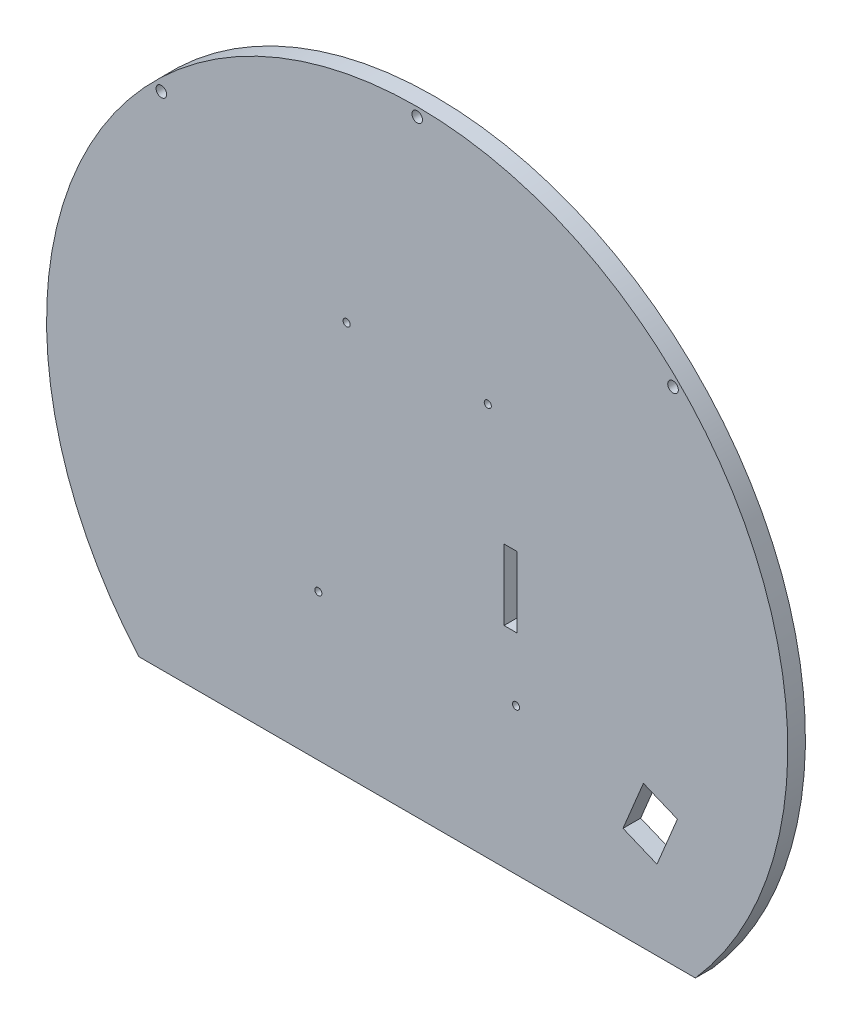
ISO-10303-21;
HEADER;
FILE_DESCRIPTION(('STEP AP214'),'2;1');
FILE_NAME('part.step','',(''),(''),'','','');
FILE_SCHEMA(('AUTOMOTIVE_DESIGN { 1 0 10303 214 1 1 1 1 }'));
ENDSEC;
DATA;
#1=APPLICATION_CONTEXT('core data for automotive mechanical design processes');
#2=APPLICATION_PROTOCOL_DEFINITION('international standard','automotive_design',2000,#1);
#3=PRODUCT_CONTEXT('',#1,'mechanical');
#4=PRODUCT('Part','Part','',(#3));
#5=PRODUCT_RELATED_PRODUCT_CATEGORY('part','',(#4));
#6=PRODUCT_DEFINITION_FORMATION('','',#4);
#7=PRODUCT_DEFINITION_CONTEXT('part definition',#1,'design');
#8=PRODUCT_DEFINITION('design','',#6,#7);
#9=PRODUCT_DEFINITION_SHAPE('','',#8);
#10=(LENGTH_UNIT() NAMED_UNIT(*) SI_UNIT(.MILLI.,.METRE.));
#11=(NAMED_UNIT(*) PLANE_ANGLE_UNIT() SI_UNIT($,.RADIAN.));
#12=(NAMED_UNIT(*) SI_UNIT($,.STERADIAN.) SOLID_ANGLE_UNIT());
#13=UNCERTAINTY_MEASURE_WITH_UNIT(LENGTH_MEASURE(1.E-05),#10,'distance_accuracy_value','');
#14=(GEOMETRIC_REPRESENTATION_CONTEXT(3) GLOBAL_UNCERTAINTY_ASSIGNED_CONTEXT((#13)) GLOBAL_UNIT_ASSIGNED_CONTEXT((#10,
#11,#12)) REPRESENTATION_CONTEXT('',''));
#15=CARTESIAN_POINT('',(0.,0.,0.));
#16=DIRECTION('',(0.,0.,1.));
#17=DIRECTION('',(1.,0.,0.));
#18=AXIS2_PLACEMENT_3D('',#15,#16,#17);
#19=CARTESIAN_POINT('',(0.,0.,5.));
#20=DIRECTION('',(0.,0.,-1.));
#21=DIRECTION('',(-1.,0.,0.));
#22=AXIS2_PLACEMENT_3D('',#19,#20,#21);
#23=CYLINDRICAL_SURFACE('',#22,105.);
#24=CARTESIAN_POINT('',(0.,0.,0.));
#25=DIRECTION('',(0.,0.,1.));
#26=DIRECTION('',(1.,0.,0.));
#27=AXIS2_PLACEMENT_3D('',#24,#25,#26);
#28=CIRCLE('',#27,105.);
#29=CARTESIAN_POINT('',(78.8107260800757,-69.3820542700435,0.));
#30=VERTEX_POINT('',#29);
#31=CARTESIAN_POINT('',(-78.8107260800757,-69.3820542700435,0.));
#32=VERTEX_POINT('',#31);
#33=EDGE_CURVE('E207',#30,#32,#28,.T.);
#34=ORIENTED_EDGE('',*,*,#33,.T.);
#35=DIRECTION('',(0.,0.,-1.));
#36=VECTOR('',#35,1.);
#37=CARTESIAN_POINT('',(-78.8107260800757,-69.3820542700435,5.));
#38=LINE('',#37,#36);
#39=CARTESIAN_POINT('',(-78.8107260800757,-69.3820542700435,5.));
#40=VERTEX_POINT('',#39);
#41=EDGE_CURVE('E11',#40,#32,#38,.T.);
#42=ORIENTED_EDGE('',*,*,#41,.F.);
#43=CARTESIAN_POINT('',(0.,0.,5.));
#44=DIRECTION('',(0.,0.,1.));
#45=DIRECTION('',(1.,0.,0.));
#46=AXIS2_PLACEMENT_3D('',#43,#44,#45);
#47=CIRCLE('',#46,105.);
#48=CARTESIAN_POINT('',(78.8107260800757,-69.3820542700435,5.));
#49=VERTEX_POINT('',#48);
#50=EDGE_CURVE('E222',#49,#40,#47,.T.);
#51=ORIENTED_EDGE('',*,*,#50,.F.);
#52=DIRECTION('',(0.,0.,-1.));
#53=VECTOR('',#52,1.);
#54=CARTESIAN_POINT('',(78.8107260800757,-69.3820542700435,5.));
#55=LINE('',#54,#53);
#56=EDGE_CURVE('E42',#49,#30,#55,.T.);
#57=ORIENTED_EDGE('',*,*,#56,.T.);
#58=EDGE_LOOP('',(#34,#42,#51,#57));
#59=FACE_BOUND('',#58,.T.);
#60=ADVANCED_FACE('F35',(#59),#23,.T.);
#61=CARTESIAN_POINT('',(78.8107260800757,-69.3820542700435,5.));
#62=DIRECTION('',(0.,1.,0.));
#63=DIRECTION('',(0.,0.,1.));
#64=AXIS2_PLACEMENT_3D('',#61,#62,#63);
#65=PLANE('',#64);
#66=DIRECTION('',(1.,0.,0.));
#67=VECTOR('',#66,1.);
#68=CARTESIAN_POINT('',(78.8107260800757,-69.3820542700435,0.));
#69=LINE('',#68,#67);
#70=EDGE_CURVE('E226',#32,#30,#69,.T.);
#71=ORIENTED_EDGE('',*,*,#70,.T.);
#72=ORIENTED_EDGE('',*,*,#56,.F.);
#73=DIRECTION('',(1.,0.,0.));
#74=VECTOR('',#73,1.);
#75=CARTESIAN_POINT('',(78.8107260800757,-69.3820542700435,5.));
#76=LINE('',#75,#74);
#77=EDGE_CURVE('E225',#40,#49,#76,.T.);
#78=ORIENTED_EDGE('',*,*,#77,.F.);
#79=ORIENTED_EDGE('',*,*,#41,.T.);
#80=EDGE_LOOP('',(#71,#72,#78,#79));
#81=FACE_BOUND('',#80,.T.);
#82=ADVANCED_FACE('F238',(#81),#65,.F.);
#83=CARTESIAN_POINT('',(0.,0.,5.));
#84=DIRECTION('',(0.,0.,1.));
#85=DIRECTION('',(1.,0.,0.));
#86=AXIS2_PLACEMENT_3D('',#83,#84,#85);
#87=PLANE('',#86);
#88=DIRECTION('',(0.,-1.,0.));
#89=VECTOR('',#88,1.);
#90=CARTESIAN_POINT('',(24.6000000009567,9.99999999718945,5.));
#91=LINE('',#90,#89);
#92=CARTESIAN_POINT('',(24.6000000009567,9.99999999718945,5.));
#93=VERTEX_POINT('',#92);
#94=CARTESIAN_POINT('',(24.6000000009567,-10.000000003204,5.));
#95=VERTEX_POINT('',#94);
#96=EDGE_CURVE('E49',#93,#95,#91,.T.);
#97=ORIENTED_EDGE('',*,*,#96,.F.);
#98=DIRECTION('',(-1.,0.,0.));
#99=VECTOR('',#98,1.);
#100=CARTESIAN_POINT('',(24.6000000009567,9.99999999718945,5.));
#101=LINE('',#100,#99);
#102=CARTESIAN_POINT('',(28.249999998801,9.99999999718945,5.));
#103=VERTEX_POINT('',#102);
#104=EDGE_CURVE('E129',#103,#93,#101,.T.);
#105=ORIENTED_EDGE('',*,*,#104,.F.);
#106=DIRECTION('',(0.,1.,0.));
#107=VECTOR('',#106,1.);
#108=CARTESIAN_POINT('',(28.249999998801,9.99999999718945,5.));
#109=LINE('',#108,#107);
#110=CARTESIAN_POINT('',(28.249999998801,-10.000000003204,5.));
#111=VERTEX_POINT('',#110);
#112=EDGE_CURVE('E132',#111,#103,#109,.T.);
#113=ORIENTED_EDGE('',*,*,#112,.F.);
#114=DIRECTION('',(1.,0.,0.));
#115=VECTOR('',#114,1.);
#116=CARTESIAN_POINT('',(24.6000000009567,-10.000000003204,5.));
#117=LINE('',#116,#115);
#118=EDGE_CURVE('E138',#95,#111,#117,.T.);
#119=ORIENTED_EDGE('',*,*,#118,.F.);
#120=EDGE_LOOP('',(#97,#105,#113,#119));
#121=FACE_BOUND('',#120,.T.);
#122=DIRECTION('',(0.923728021347068,-0.383049008063238,0.));
#123=VECTOR('',#122,1.);
#124=CARTESIAN_POINT('',(67.937761884798,-46.9074365144283,5.));
#125=LINE('',#124,#123);
#126=CARTESIAN_POINT('',(58.3125159023615,-42.9160658504094,5.));
#127=VERTEX_POINT('',#126);
#128=CARTESIAN_POINT('',(67.937761884798,-46.9074365144283,5.));
#129=VERTEX_POINT('',#128);
#130=EDGE_CURVE('E144',#127,#129,#125,.T.);
#131=ORIENTED_EDGE('',*,*,#130,.F.);
#132=DIRECTION('',(-0.383049008063238,-0.923728021347068,0.));
#133=VECTOR('',#132,1.);
#134=CARTESIAN_POINT('',(58.3125159023615,-42.9160658504094,5.));
#135=LINE('',#134,#133);
#136=CARTESIAN_POINT('',(64.0965559241164,-28.9677727280686,5.));
#137=VERTEX_POINT('',#136);
#138=EDGE_CURVE('E152',#137,#127,#135,.T.);
#139=ORIENTED_EDGE('',*,*,#138,.F.);
#140=DIRECTION('',(-0.923728021347068,0.383049008063238,0.));
#141=VECTOR('',#140,1.);
#142=CARTESIAN_POINT('',(64.0965559241164,-28.9677727280686,5.));
#143=LINE('',#142,#141);
#144=CARTESIAN_POINT('',(73.7218019065529,-32.9591433920876,5.));
#145=VERTEX_POINT('',#144);
#146=EDGE_CURVE('E166',#145,#137,#143,.T.);
#147=ORIENTED_EDGE('',*,*,#146,.F.);
#148=DIRECTION('',(0.383049008063238,0.923728021347068,0.));
#149=VECTOR('',#148,1.);
#150=CARTESIAN_POINT('',(73.7218019065529,-32.9591433920876,5.));
#151=LINE('',#150,#149);
#152=EDGE_CURVE('E163',#129,#145,#151,.T.);
#153=ORIENTED_EDGE('',*,*,#152,.F.);
#154=EDGE_LOOP('',(#131,#139,#147,#153));
#155=FACE_BOUND('',#154,.T.);
#156=CARTESIAN_POINT('',(27.9999999968608,-28.000000003177,5.));
#157=DIRECTION('',(0.,0.,1.));
#158=DIRECTION('',(1.,0.,0.));
#159=AXIS2_PLACEMENT_3D('',#156,#157,#158);
#160=CIRCLE('',#159,0.999999999999628);
#161=CARTESIAN_POINT('',(28.9999999968604,-28.000000003177,5.));
#162=VERTEX_POINT('',#161);
#163=EDGE_CURVE('E173',#162,#162,#160,.T.);
#164=ORIENTED_EDGE('',*,*,#163,.F.);
#165=EDGE_LOOP('',(#164));
#166=FACE_BOUND('',#165,.T.);
#167=CARTESIAN_POINT('',(-28.0000000031392,-27.9999999971406,5.));
#168=DIRECTION('',(0.,0.,1.));
#169=DIRECTION('',(1.,0.,0.));
#170=AXIS2_PLACEMENT_3D('',#167,#168,#169);
#171=CIRCLE('',#170,1.);
#172=CARTESIAN_POINT('',(-27.0000000031392,-27.9999999971406,5.));
#173=VERTEX_POINT('',#172);
#174=EDGE_CURVE('E190',#173,#173,#171,.T.);
#175=ORIENTED_EDGE('',*,*,#174,.F.);
#176=EDGE_LOOP('',(#175));
#177=FACE_BOUND('',#176,.T.);
#178=CARTESIAN_POINT('',(-19.999999995594,42.0000000019961,5.));
#179=DIRECTION('',(0.,0.,1.));
#180=DIRECTION('',(1.,0.,0.));
#181=AXIS2_PLACEMENT_3D('',#178,#179,#180);
#182=CIRCLE('',#181,1.00000000000002);
#183=CARTESIAN_POINT('',(-18.999999995594,42.0000000019961,5.));
#184=VERTEX_POINT('',#183);
#185=EDGE_CURVE('E184',#184,#184,#182,.T.);
#186=ORIENTED_EDGE('',*,*,#185,.F.);
#187=EDGE_LOOP('',(#186));
#188=FACE_BOUND('',#187,.T.);
#189=CARTESIAN_POINT('',(20.000000004406,41.9999999976845,5.));
#190=DIRECTION('',(0.,0.,1.));
#191=DIRECTION('',(1.,0.,0.));
#192=AXIS2_PLACEMENT_3D('',#189,#190,#191);
#193=CIRCLE('',#192,0.999999999999995);
#194=CARTESIAN_POINT('',(21.000000004406,41.9999999976845,5.));
#195=VERTEX_POINT('',#194);
#196=EDGE_CURVE('E183',#195,#195,#193,.T.);
#197=ORIENTED_EDGE('',*,*,#196,.F.);
#198=EDGE_LOOP('',(#197));
#199=FACE_BOUND('',#198,.T.);
#200=CARTESIAN_POINT('',(0.,102.5,5.));
#201=DIRECTION('',(0.,0.,1.));
#202=DIRECTION('',(1.,0.,0.));
#203=AXIS2_PLACEMENT_3D('',#200,#201,#202);
#204=CIRCLE('',#203,1.5);
#205=CARTESIAN_POINT('',(1.5,102.5,5.));
#206=VERTEX_POINT('',#205);
#207=EDGE_CURVE('E208',#206,#206,#204,.T.);
#208=ORIENTED_EDGE('',*,*,#207,.F.);
#209=EDGE_LOOP('',(#208));
#210=FACE_BOUND('',#209,.T.);
#211=CARTESIAN_POINT('',(72.4784450716207,72.4784450716215,5.));
#212=DIRECTION('',(0.,0.,1.));
#213=DIRECTION('',(1.,0.,0.));
#214=AXIS2_PLACEMENT_3D('',#211,#212,#213);
#215=CIRCLE('',#214,1.5);
#216=CARTESIAN_POINT('',(73.9784450716207,72.4784450716215,5.));
#217=VERTEX_POINT('',#216);
#218=EDGE_CURVE('E214',#217,#217,#215,.T.);
#219=ORIENTED_EDGE('',*,*,#218,.F.);
#220=EDGE_LOOP('',(#219));
#221=FACE_BOUND('',#220,.T.);
#222=CARTESIAN_POINT('',(-72.4784450716207,72.4784450716215,5.));
#223=DIRECTION('',(0.,0.,1.));
#224=DIRECTION('',(1.,0.,0.));
#225=AXIS2_PLACEMENT_3D('',#222,#223,#224);
#226=CIRCLE('',#225,1.5);
#227=CARTESIAN_POINT('',(-70.9784450716207,72.4784450716215,5.));
#228=VERTEX_POINT('',#227);
#229=EDGE_CURVE('E201',#228,#228,#226,.T.);
#230=ORIENTED_EDGE('',*,*,#229,.F.);
#231=EDGE_LOOP('',(#230));
#232=FACE_BOUND('',#231,.T.);
#233=ORIENTED_EDGE('',*,*,#50,.T.);
#234=ORIENTED_EDGE('',*,*,#77,.T.);
#235=EDGE_LOOP('',(#233,#234));
#236=FACE_BOUND('',#235,.T.);
#237=ADVANCED_FACE('F240',(#121,#155,#166,#177,#188,#199,#210,#221,#232,#236),#87,.T.);
#238=CARTESIAN_POINT('',(0.,0.,0.));
#239=DIRECTION('',(0.,0.,1.));
#240=DIRECTION('',(1.,0.,0.));
#241=AXIS2_PLACEMENT_3D('',#238,#239,#240);
#242=PLANE('',#241);
#243=DIRECTION('',(-1.,0.,0.));
#244=VECTOR('',#243,1.);
#245=CARTESIAN_POINT('',(24.6000000009567,9.99999999718945,0.));
#246=LINE('',#245,#244);
#247=CARTESIAN_POINT('',(28.249999998801,9.99999999718945,0.));
#248=VERTEX_POINT('',#247);
#249=CARTESIAN_POINT('',(24.6000000009567,9.99999999718945,0.));
#250=VERTEX_POINT('',#249);
#251=EDGE_CURVE('E119',#248,#250,#246,.T.);
#252=ORIENTED_EDGE('',*,*,#251,.T.);
#253=DIRECTION('',(0.,-1.,0.));
#254=VECTOR('',#253,1.);
#255=CARTESIAN_POINT('',(24.6000000009567,9.99999999718945,0.));
#256=LINE('',#255,#254);
#257=CARTESIAN_POINT('',(24.6000000009567,-10.000000003204,0.));
#258=VERTEX_POINT('',#257);
#259=EDGE_CURVE('E113',#250,#258,#256,.T.);
#260=ORIENTED_EDGE('',*,*,#259,.T.);
#261=DIRECTION('',(1.,0.,0.));
#262=VECTOR('',#261,1.);
#263=CARTESIAN_POINT('',(24.6000000009567,-10.000000003204,0.));
#264=LINE('',#263,#262);
#265=CARTESIAN_POINT('',(28.249999998801,-10.000000003204,0.));
#266=VERTEX_POINT('',#265);
#267=EDGE_CURVE('E122',#258,#266,#264,.T.);
#268=ORIENTED_EDGE('',*,*,#267,.T.);
#269=DIRECTION('',(0.,1.,0.));
#270=VECTOR('',#269,1.);
#271=CARTESIAN_POINT('',(28.249999998801,9.99999999718945,0.));
#272=LINE('',#271,#270);
#273=EDGE_CURVE('E57',#266,#248,#272,.T.);
#274=ORIENTED_EDGE('',*,*,#273,.T.);
#275=EDGE_LOOP('',(#252,#260,#268,#274));
#276=FACE_BOUND('',#275,.T.);
#277=DIRECTION('',(-0.383049008063238,-0.923728021347068,0.));
#278=VECTOR('',#277,1.);
#279=CARTESIAN_POINT('',(58.3125159023615,-42.9160658504094,0.));
#280=LINE('',#279,#278);
#281=CARTESIAN_POINT('',(64.0965559241164,-28.9677727280686,0.));
#282=VERTEX_POINT('',#281);
#283=CARTESIAN_POINT('',(58.3125159023615,-42.9160658504094,0.));
#284=VERTEX_POINT('',#283);
#285=EDGE_CURVE('E158',#282,#284,#280,.T.);
#286=ORIENTED_EDGE('',*,*,#285,.T.);
#287=DIRECTION('',(0.923728021347068,-0.383049008063238,0.));
#288=VECTOR('',#287,1.);
#289=CARTESIAN_POINT('',(67.937761884798,-46.9074365144283,0.));
#290=LINE('',#289,#288);
#291=CARTESIAN_POINT('',(67.937761884798,-46.9074365144283,0.));
#292=VERTEX_POINT('',#291);
#293=EDGE_CURVE('E148',#284,#292,#290,.T.);
#294=ORIENTED_EDGE('',*,*,#293,.T.);
#295=DIRECTION('',(0.383049008063238,0.923728021347068,0.));
#296=VECTOR('',#295,1.);
#297=CARTESIAN_POINT('',(73.7218019065529,-32.9591433920876,0.));
#298=LINE('',#297,#296);
#299=CARTESIAN_POINT('',(73.7218019065529,-32.9591433920876,0.));
#300=VERTEX_POINT('',#299);
#301=EDGE_CURVE('E151',#292,#300,#298,.T.);
#302=ORIENTED_EDGE('',*,*,#301,.T.);
#303=DIRECTION('',(-0.923728021347068,0.383049008063238,0.));
#304=VECTOR('',#303,1.);
#305=CARTESIAN_POINT('',(64.0965559241164,-28.9677727280686,0.));
#306=LINE('',#305,#304);
#307=EDGE_CURVE('E155',#300,#282,#306,.T.);
#308=ORIENTED_EDGE('',*,*,#307,.T.);
#309=EDGE_LOOP('',(#286,#294,#302,#308));
#310=FACE_BOUND('',#309,.T.);
#311=CARTESIAN_POINT('',(27.9999999968608,-28.000000003177,0.));
#312=DIRECTION('',(0.,0.,1.));
#313=DIRECTION('',(1.,0.,0.));
#314=AXIS2_PLACEMENT_3D('',#311,#312,#313);
#315=CIRCLE('',#314,0.999999999999628);
#316=CARTESIAN_POINT('',(28.9999999968604,-28.000000003177,0.));
#317=VERTEX_POINT('',#316);
#318=EDGE_CURVE('E193',#317,#317,#315,.T.);
#319=ORIENTED_EDGE('',*,*,#318,.T.);
#320=EDGE_LOOP('',(#319));
#321=FACE_BOUND('',#320,.T.);
#322=CARTESIAN_POINT('',(-28.0000000031392,-27.9999999971406,0.));
#323=DIRECTION('',(0.,0.,1.));
#324=DIRECTION('',(1.,0.,0.));
#325=AXIS2_PLACEMENT_3D('',#322,#323,#324);
#326=CIRCLE('',#325,1.);
#327=CARTESIAN_POINT('',(-27.0000000031392,-27.9999999971406,0.));
#328=VERTEX_POINT('',#327);
#329=EDGE_CURVE('E187',#328,#328,#326,.T.);
#330=ORIENTED_EDGE('',*,*,#329,.T.);
#331=EDGE_LOOP('',(#330));
#332=FACE_BOUND('',#331,.T.);
#333=CARTESIAN_POINT('',(-19.999999995594,42.0000000019961,0.));
#334=DIRECTION('',(0.,0.,1.));
#335=DIRECTION('',(1.,0.,0.));
#336=AXIS2_PLACEMENT_3D('',#333,#334,#335);
#337=CIRCLE('',#336,1.00000000000002);
#338=CARTESIAN_POINT('',(-18.999999995594,42.0000000019961,0.));
#339=VERTEX_POINT('',#338);
#340=EDGE_CURVE('E180',#339,#339,#337,.T.);
#341=ORIENTED_EDGE('',*,*,#340,.T.);
#342=EDGE_LOOP('',(#341));
#343=FACE_BOUND('',#342,.T.);
#344=CARTESIAN_POINT('',(20.000000004406,41.9999999976845,0.));
#345=DIRECTION('',(0.,0.,1.));
#346=DIRECTION('',(1.,0.,0.));
#347=AXIS2_PLACEMENT_3D('',#344,#345,#346);
#348=CIRCLE('',#347,0.999999999999995);
#349=CARTESIAN_POINT('',(21.000000004406,41.9999999976845,0.));
#350=VERTEX_POINT('',#349);
#351=EDGE_CURVE('E198',#350,#350,#348,.T.);
#352=ORIENTED_EDGE('',*,*,#351,.T.);
#353=EDGE_LOOP('',(#352));
#354=FACE_BOUND('',#353,.T.);
#355=CARTESIAN_POINT('',(0.,102.5,0.));
#356=DIRECTION('',(0.,0.,1.));
#357=DIRECTION('',(1.,0.,0.));
#358=AXIS2_PLACEMENT_3D('',#355,#356,#357);
#359=CIRCLE('',#358,1.5);
#360=CARTESIAN_POINT('',(1.5,102.5,0.));
#361=VERTEX_POINT('',#360);
#362=EDGE_CURVE('E204',#361,#361,#359,.T.);
#363=ORIENTED_EDGE('',*,*,#362,.T.);
#364=EDGE_LOOP('',(#363));
#365=FACE_BOUND('',#364,.T.);
#366=CARTESIAN_POINT('',(72.4784450716207,72.4784450716215,0.));
#367=DIRECTION('',(0.,0.,1.));
#368=DIRECTION('',(1.,0.,0.));
#369=AXIS2_PLACEMENT_3D('',#366,#367,#368);
#370=CIRCLE('',#369,1.5);
#371=CARTESIAN_POINT('',(73.9784450716207,72.4784450716215,0.));
#372=VERTEX_POINT('',#371);
#373=EDGE_CURVE('E211',#372,#372,#370,.T.);
#374=ORIENTED_EDGE('',*,*,#373,.T.);
#375=EDGE_LOOP('',(#374));
#376=FACE_BOUND('',#375,.T.);
#377=CARTESIAN_POINT('',(-72.4784450716207,72.4784450716215,0.));
#378=DIRECTION('',(0.,0.,1.));
#379=DIRECTION('',(1.,0.,0.));
#380=AXIS2_PLACEMENT_3D('',#377,#378,#379);
#381=CIRCLE('',#380,1.5);
#382=CARTESIAN_POINT('',(-70.9784450716207,72.4784450716215,0.));
#383=VERTEX_POINT('',#382);
#384=EDGE_CURVE('E217',#383,#383,#381,.T.);
#385=ORIENTED_EDGE('',*,*,#384,.T.);
#386=EDGE_LOOP('',(#385));
#387=FACE_BOUND('',#386,.T.);
#388=ORIENTED_EDGE('',*,*,#33,.F.);
#389=ORIENTED_EDGE('',*,*,#70,.F.);
#390=EDGE_LOOP('',(#388,#389));
#391=FACE_BOUND('',#390,.T.);
#392=ADVANCED_FACE('F126',(#276,#310,#321,#332,#343,#354,#365,#376,#387,#391),#242,.F.);
#393=CARTESIAN_POINT('',(-72.4784450716207,72.4784450716215,0.));
#394=DIRECTION('',(0.,0.,1.));
#395=DIRECTION('',(1.,0.,0.));
#396=AXIS2_PLACEMENT_3D('',#393,#394,#395);
#397=CYLINDRICAL_SURFACE('',#396,1.5);
#398=ORIENTED_EDGE('',*,*,#384,.F.);
#399=EDGE_LOOP('',(#398));
#400=FACE_BOUND('',#399,.T.);
#401=ORIENTED_EDGE('',*,*,#229,.T.);
#402=EDGE_LOOP('',(#401));
#403=FACE_BOUND('',#402,.T.);
#404=ADVANCED_FACE('F248',(#400,#403),#397,.F.);
#405=CARTESIAN_POINT('',(72.4784450716207,72.4784450716215,0.));
#406=DIRECTION('',(0.,0.,1.));
#407=DIRECTION('',(1.,0.,0.));
#408=AXIS2_PLACEMENT_3D('',#405,#406,#407);
#409=CYLINDRICAL_SURFACE('',#408,1.5);
#410=ORIENTED_EDGE('',*,*,#373,.F.);
#411=EDGE_LOOP('',(#410));
#412=FACE_BOUND('',#411,.T.);
#413=ORIENTED_EDGE('',*,*,#218,.T.);
#414=EDGE_LOOP('',(#413));
#415=FACE_BOUND('',#414,.T.);
#416=ADVANCED_FACE('F278',(#412,#415),#409,.F.);
#417=CARTESIAN_POINT('',(0.,102.5,0.));
#418=DIRECTION('',(0.,0.,1.));
#419=DIRECTION('',(1.,0.,0.));
#420=AXIS2_PLACEMENT_3D('',#417,#418,#419);
#421=CYLINDRICAL_SURFACE('',#420,1.5);
#422=ORIENTED_EDGE('',*,*,#362,.F.);
#423=EDGE_LOOP('',(#422));
#424=FACE_BOUND('',#423,.T.);
#425=ORIENTED_EDGE('',*,*,#207,.T.);
#426=EDGE_LOOP('',(#425));
#427=FACE_BOUND('',#426,.T.);
#428=ADVANCED_FACE('F284',(#424,#427),#421,.F.);
#429=CARTESIAN_POINT('',(20.000000004406,41.9999999976845,0.));
#430=DIRECTION('',(0.,0.,1.));
#431=DIRECTION('',(1.,0.,0.));
#432=AXIS2_PLACEMENT_3D('',#429,#430,#431);
#433=CYLINDRICAL_SURFACE('',#432,0.999999999999995);
#434=ORIENTED_EDGE('',*,*,#351,.F.);
#435=EDGE_LOOP('',(#434));
#436=FACE_BOUND('',#435,.T.);
#437=ORIENTED_EDGE('',*,*,#196,.T.);
#438=EDGE_LOOP('',(#437));
#439=FACE_BOUND('',#438,.T.);
#440=ADVANCED_FACE('F292',(#436,#439),#433,.F.);
#441=CARTESIAN_POINT('',(-19.999999995594,42.0000000019961,0.));
#442=DIRECTION('',(0.,0.,1.));
#443=DIRECTION('',(1.,0.,0.));
#444=AXIS2_PLACEMENT_3D('',#441,#442,#443);
#445=CYLINDRICAL_SURFACE('',#444,1.00000000000002);
#446=ORIENTED_EDGE('',*,*,#340,.F.);
#447=EDGE_LOOP('',(#446));
#448=FACE_BOUND('',#447,.T.);
#449=ORIENTED_EDGE('',*,*,#185,.T.);
#450=EDGE_LOOP('',(#449));
#451=FACE_BOUND('',#450,.T.);
#452=ADVANCED_FACE('F300',(#448,#451),#445,.F.);
#453=CARTESIAN_POINT('',(-28.0000000031392,-27.9999999971406,0.));
#454=DIRECTION('',(0.,0.,1.));
#455=DIRECTION('',(1.,0.,0.));
#456=AXIS2_PLACEMENT_3D('',#453,#454,#455);
#457=CYLINDRICAL_SURFACE('',#456,1.);
#458=ORIENTED_EDGE('',*,*,#329,.F.);
#459=EDGE_LOOP('',(#458));
#460=FACE_BOUND('',#459,.T.);
#461=ORIENTED_EDGE('',*,*,#174,.T.);
#462=EDGE_LOOP('',(#461));
#463=FACE_BOUND('',#462,.T.);
#464=ADVANCED_FACE('F308',(#460,#463),#457,.F.);
#465=CARTESIAN_POINT('',(27.9999999968608,-28.000000003177,0.));
#466=DIRECTION('',(0.,0.,1.));
#467=DIRECTION('',(1.,0.,0.));
#468=AXIS2_PLACEMENT_3D('',#465,#466,#467);
#469=CYLINDRICAL_SURFACE('',#468,0.999999999999628);
#470=ORIENTED_EDGE('',*,*,#318,.F.);
#471=EDGE_LOOP('',(#470));
#472=FACE_BOUND('',#471,.T.);
#473=ORIENTED_EDGE('',*,*,#163,.T.);
#474=EDGE_LOOP('',(#473));
#475=FACE_BOUND('',#474,.T.);
#476=ADVANCED_FACE('F316',(#472,#475),#469,.F.);
#477=CARTESIAN_POINT('',(67.937761884798,-46.9074365144283,0.));
#478=DIRECTION('',(-0.383049008063238,-0.923728021347068,0.));
#479=DIRECTION('',(0.923728021347068,-0.383049008063238,0.));
#480=AXIS2_PLACEMENT_3D('',#477,#478,#479);
#481=PLANE('',#480);
#482=ORIENTED_EDGE('',*,*,#130,.T.);
#483=DIRECTION('',(0.,0.,1.));
#484=VECTOR('',#483,1.);
#485=CARTESIAN_POINT('',(67.937761884798,-46.9074365144283,0.));
#486=LINE('',#485,#484);
#487=EDGE_CURVE('E161',#292,#129,#486,.T.);
#488=ORIENTED_EDGE('',*,*,#487,.F.);
#489=ORIENTED_EDGE('',*,*,#293,.F.);
#490=DIRECTION('',(0.,0.,1.));
#491=VECTOR('',#490,1.);
#492=CARTESIAN_POINT('',(58.3125159023615,-42.9160658504094,0.));
#493=LINE('',#492,#491);
#494=EDGE_CURVE('E171',#284,#127,#493,.T.);
#495=ORIENTED_EDGE('',*,*,#494,.T.);
#496=EDGE_LOOP('',(#482,#488,#489,#495));
#497=FACE_BOUND('',#496,.T.);
#498=ADVANCED_FACE('F324',(#497),#481,.F.);
#499=CARTESIAN_POINT('',(58.3125159023615,-42.9160658504094,0.));
#500=DIRECTION('',(-0.923728021347068,0.383049008063238,0.));
#501=DIRECTION('',(-0.383049008063238,-0.923728021347068,0.));
#502=AXIS2_PLACEMENT_3D('',#499,#500,#501);
#503=PLANE('',#502);
#504=ORIENTED_EDGE('',*,*,#138,.T.);
#505=ORIENTED_EDGE('',*,*,#494,.F.);
#506=ORIENTED_EDGE('',*,*,#285,.F.);
#507=DIRECTION('',(0.,0.,1.));
#508=VECTOR('',#507,1.);
#509=CARTESIAN_POINT('',(64.0965559241164,-28.9677727280686,0.));
#510=LINE('',#509,#508);
#511=EDGE_CURVE('E174',#282,#137,#510,.T.);
#512=ORIENTED_EDGE('',*,*,#511,.T.);
#513=EDGE_LOOP('',(#504,#505,#506,#512));
#514=FACE_BOUND('',#513,.T.);
#515=ADVANCED_FACE('F332',(#514),#503,.F.);
#516=CARTESIAN_POINT('',(64.0965559241164,-28.9677727280686,0.));
#517=DIRECTION('',(0.383049008063238,0.923728021347068,0.));
#518=DIRECTION('',(-0.923728021347068,0.383049008063238,0.));
#519=AXIS2_PLACEMENT_3D('',#516,#517,#518);
#520=PLANE('',#519);
#521=ORIENTED_EDGE('',*,*,#146,.T.);
#522=ORIENTED_EDGE('',*,*,#511,.F.);
#523=ORIENTED_EDGE('',*,*,#307,.F.);
#524=DIRECTION('',(0.,0.,1.));
#525=VECTOR('',#524,1.);
#526=CARTESIAN_POINT('',(73.7218019065529,-32.9591433920876,0.));
#527=LINE('',#526,#525);
#528=EDGE_CURVE('E176',#300,#145,#527,.T.);
#529=ORIENTED_EDGE('',*,*,#528,.T.);
#530=EDGE_LOOP('',(#521,#522,#523,#529));
#531=FACE_BOUND('',#530,.T.);
#532=ADVANCED_FACE('F340',(#531),#520,.F.);
#533=CARTESIAN_POINT('',(73.7218019065529,-32.9591433920876,0.));
#534=DIRECTION('',(0.923728021347068,-0.383049008063238,0.));
#535=DIRECTION('',(0.383049008063238,0.923728021347068,0.));
#536=AXIS2_PLACEMENT_3D('',#533,#534,#535);
#537=PLANE('',#536);
#538=ORIENTED_EDGE('',*,*,#152,.T.);
#539=ORIENTED_EDGE('',*,*,#528,.F.);
#540=ORIENTED_EDGE('',*,*,#301,.F.);
#541=ORIENTED_EDGE('',*,*,#487,.T.);
#542=EDGE_LOOP('',(#538,#539,#540,#541));
#543=FACE_BOUND('',#542,.T.);
#544=ADVANCED_FACE('F348',(#543),#537,.F.);
#545=CARTESIAN_POINT('',(24.6000000009567,9.99999999718945,0.));
#546=DIRECTION('',(-1.,0.,0.));
#547=DIRECTION('',(0.,0.,1.));
#548=AXIS2_PLACEMENT_3D('',#545,#546,#547);
#549=PLANE('',#548);
#550=ORIENTED_EDGE('',*,*,#96,.T.);
#551=DIRECTION('',(0.,0.,1.));
#552=VECTOR('',#551,1.);
#553=CARTESIAN_POINT('',(24.6000000009567,-10.000000003204,0.));
#554=LINE('',#553,#552);
#555=EDGE_CURVE('E109',#258,#95,#554,.T.);
#556=ORIENTED_EDGE('',*,*,#555,.F.);
#557=ORIENTED_EDGE('',*,*,#259,.F.);
#558=DIRECTION('',(0.,0.,1.));
#559=VECTOR('',#558,1.);
#560=CARTESIAN_POINT('',(24.6000000009567,9.99999999718945,0.));
#561=LINE('',#560,#559);
#562=EDGE_CURVE('E142',#250,#93,#561,.T.);
#563=ORIENTED_EDGE('',*,*,#562,.T.);
#564=EDGE_LOOP('',(#550,#556,#557,#563));
#565=FACE_BOUND('',#564,.T.);
#566=ADVANCED_FACE('F111',(#565),#549,.F.);
#567=CARTESIAN_POINT('',(24.6000000009567,9.99999999718945,0.));
#568=DIRECTION('',(0.,1.,0.));
#569=DIRECTION('',(0.,0.,1.));
#570=AXIS2_PLACEMENT_3D('',#567,#568,#569);
#571=PLANE('',#570);
#572=ORIENTED_EDGE('',*,*,#104,.T.);
#573=ORIENTED_EDGE('',*,*,#562,.F.);
#574=ORIENTED_EDGE('',*,*,#251,.F.);
#575=DIRECTION('',(0.,0.,1.));
#576=VECTOR('',#575,1.);
#577=CARTESIAN_POINT('',(28.249999998801,9.99999999718945,0.));
#578=LINE('',#577,#576);
#579=EDGE_CURVE('E145',#248,#103,#578,.T.);
#580=ORIENTED_EDGE('',*,*,#579,.T.);
#581=EDGE_LOOP('',(#572,#573,#574,#580));
#582=FACE_BOUND('',#581,.T.);
#583=ADVANCED_FACE('F361',(#582),#571,.F.);
#584=CARTESIAN_POINT('',(28.249999998801,9.99999999718945,0.));
#585=DIRECTION('',(1.,0.,0.));
#586=DIRECTION('',(0.,0.,-1.));
#587=AXIS2_PLACEMENT_3D('',#584,#585,#586);
#588=PLANE('',#587);
#589=ORIENTED_EDGE('',*,*,#112,.T.);
#590=ORIENTED_EDGE('',*,*,#579,.F.);
#591=ORIENTED_EDGE('',*,*,#273,.F.);
#592=DIRECTION('',(0.,0.,1.));
#593=VECTOR('',#592,1.);
#594=CARTESIAN_POINT('',(28.249999998801,-10.000000003204,0.));
#595=LINE('',#594,#593);
#596=EDGE_CURVE('E118',#266,#111,#595,.T.);
#597=ORIENTED_EDGE('',*,*,#596,.T.);
#598=EDGE_LOOP('',(#589,#590,#591,#597));
#599=FACE_BOUND('',#598,.T.);
#600=ADVANCED_FACE('F368',(#599),#588,.F.);
#601=CARTESIAN_POINT('',(24.6000000009567,-10.000000003204,0.));
#602=DIRECTION('',(0.,-1.,0.));
#603=DIRECTION('',(0.,0.,-1.));
#604=AXIS2_PLACEMENT_3D('',#601,#602,#603);
#605=PLANE('',#604);
#606=ORIENTED_EDGE('',*,*,#118,.T.);
#607=ORIENTED_EDGE('',*,*,#596,.F.);
#608=ORIENTED_EDGE('',*,*,#267,.F.);
#609=ORIENTED_EDGE('',*,*,#555,.T.);
#610=EDGE_LOOP('',(#606,#607,#608,#609));
#611=FACE_BOUND('',#610,.T.);
#612=ADVANCED_FACE('F123',(#611),#605,.F.);
#613=CLOSED_SHELL('',(#60,#82,#237,#392,#404,#416,#428,#440,#452,#464,#476,#498,#515,#532,#544,
#566,#583,#600,#612));
#614=MANIFOLD_SOLID_BREP('B2',#613);
#615=ADVANCED_BREP_SHAPE_REPRESENTATION('',(#18,#614),#14);
#616=SHAPE_DEFINITION_REPRESENTATION(#9,#615);
ENDSEC;
END-ISO-10303-21;
